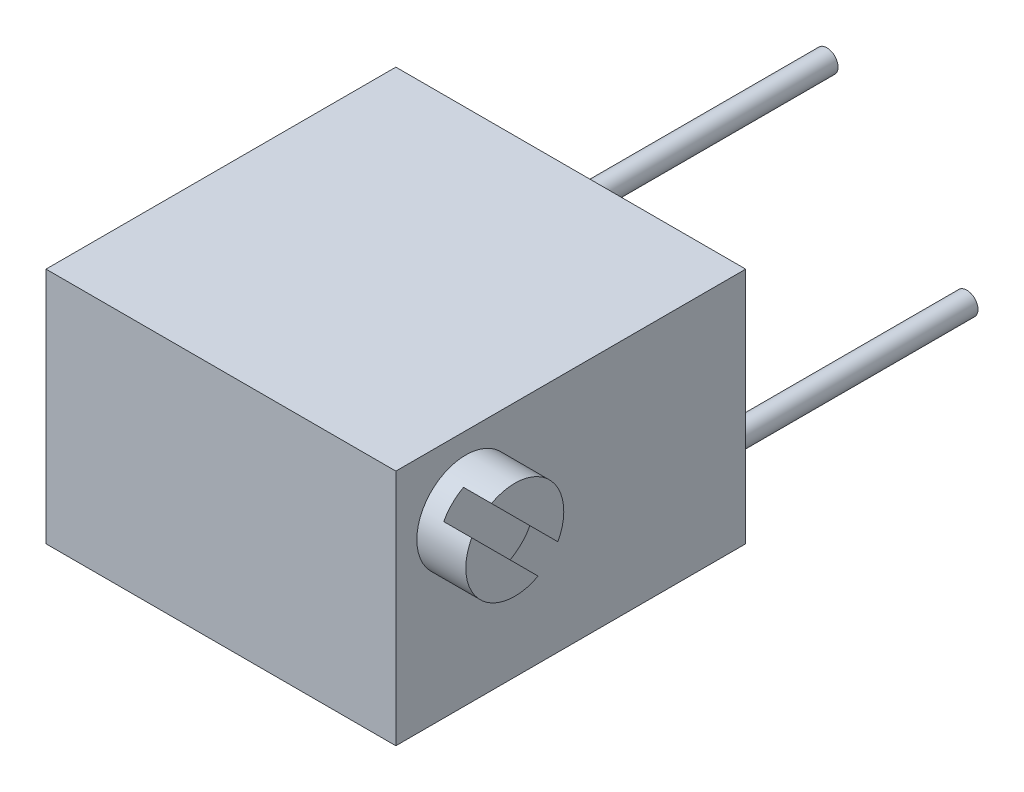
ISO-10303-21;
HEADER;
FILE_DESCRIPTION(('STEP AP214'),'2;1');
FILE_NAME('part.step','',(''),(''),'','','');
FILE_SCHEMA(('AUTOMOTIVE_DESIGN { 1 0 10303 214 1 1 1 1 }'));
ENDSEC;
DATA;
#1=APPLICATION_CONTEXT('core data for automotive mechanical design processes');
#2=APPLICATION_PROTOCOL_DEFINITION('international standard','automotive_design',2000,#1);
#3=PRODUCT_CONTEXT('',#1,'mechanical');
#4=PRODUCT('Part','Part','',(#3));
#5=PRODUCT_RELATED_PRODUCT_CATEGORY('part','',(#4));
#6=PRODUCT_DEFINITION_FORMATION('','',#4);
#7=PRODUCT_DEFINITION_CONTEXT('part definition',#1,'design');
#8=PRODUCT_DEFINITION('design','',#6,#7);
#9=PRODUCT_DEFINITION_SHAPE('','',#8);
#10=(LENGTH_UNIT() NAMED_UNIT(*) SI_UNIT(.MILLI.,.METRE.));
#11=(NAMED_UNIT(*) PLANE_ANGLE_UNIT() SI_UNIT($,.RADIAN.));
#12=(NAMED_UNIT(*) SI_UNIT($,.STERADIAN.) SOLID_ANGLE_UNIT());
#13=UNCERTAINTY_MEASURE_WITH_UNIT(LENGTH_MEASURE(1.E-05),#10,'distance_accuracy_value','');
#14=(GEOMETRIC_REPRESENTATION_CONTEXT(3) GLOBAL_UNCERTAINTY_ASSIGNED_CONTEXT((#13)) GLOBAL_UNIT_ASSIGNED_CONTEXT((#10,
#11,#12)) REPRESENTATION_CONTEXT('',''));
#15=CARTESIAN_POINT('',(0.,0.,0.));
#16=DIRECTION('',(0.,0.,1.));
#17=DIRECTION('',(1.,0.,0.));
#18=AXIS2_PLACEMENT_3D('',#15,#16,#17);
#19=CARTESIAN_POINT('',(-0.507999999999999,-3.302,0.));
#20=DIRECTION('',(0.,0.,1.));
#21=DIRECTION('',(1.,0.,0.));
#22=AXIS2_PLACEMENT_3D('',#19,#20,#21);
#23=PLANE('',#22);
#24=CARTESIAN_POINT('',(5.08,-2.286,0.));
#25=DIRECTION('',(0.,0.,1.));
#26=DIRECTION('',(1.,0.,0.));
#27=AXIS2_PLACEMENT_3D('',#24,#25,#26);
#28=CIRCLE('',#27,0.203199999999999);
#29=CARTESIAN_POINT('',(5.2832,-2.286,0.));
#30=VERTEX_POINT('',#29);
#31=EDGE_CURVE('E42',#30,#30,#28,.F.);
#32=ORIENTED_EDGE('',*,*,#31,.F.);
#33=EDGE_LOOP('',(#32));
#34=FACE_BOUND('',#33,.T.);
#35=DIRECTION('',(0.,-1.,0.));
#36=VECTOR('',#35,1.);
#37=CARTESIAN_POINT('',(-0.508,1.016,0.));
#38=LINE('',#37,#36);
#39=CARTESIAN_POINT('',(-0.508,1.016,0.));
#40=VERTEX_POINT('',#39);
#41=CARTESIAN_POINT('',(-0.507999999999999,-3.302,0.));
#42=VERTEX_POINT('',#41);
#43=EDGE_CURVE('E148',#40,#42,#38,.T.);
#44=ORIENTED_EDGE('',*,*,#43,.F.);
#45=DIRECTION('',(-1.,0.,0.));
#46=VECTOR('',#45,1.);
#47=CARTESIAN_POINT('',(5.842,1.016,0.));
#48=LINE('',#47,#46);
#49=CARTESIAN_POINT('',(5.842,1.016,0.));
#50=VERTEX_POINT('',#49);
#51=EDGE_CURVE('E79',#50,#40,#48,.T.);
#52=ORIENTED_EDGE('',*,*,#51,.F.);
#53=DIRECTION('',(0.,1.,0.));
#54=VECTOR('',#53,1.);
#55=CARTESIAN_POINT('',(5.842,-3.302,0.));
#56=LINE('',#55,#54);
#57=CARTESIAN_POINT('',(5.842,-3.302,0.));
#58=VERTEX_POINT('',#57);
#59=EDGE_CURVE('E153',#58,#50,#56,.T.);
#60=ORIENTED_EDGE('',*,*,#59,.F.);
#61=DIRECTION('',(1.,0.,0.));
#62=VECTOR('',#61,1.);
#63=CARTESIAN_POINT('',(-0.507999999999999,-3.302,0.));
#64=LINE('',#63,#62);
#65=EDGE_CURVE('E151',#42,#58,#64,.T.);
#66=ORIENTED_EDGE('',*,*,#65,.F.);
#67=EDGE_LOOP('',(#44,#52,#60,#66));
#68=FACE_BOUND('',#67,.T.);
#69=CARTESIAN_POINT('',(0.,-2.286,0.));
#70=DIRECTION('',(0.,0.,1.));
#71=DIRECTION('',(1.,0.,0.));
#72=AXIS2_PLACEMENT_3D('',#69,#70,#71);
#73=CIRCLE('',#72,0.2032);
#74=CARTESIAN_POINT('',(0.2032,-2.286,0.));
#75=VERTEX_POINT('',#74);
#76=EDGE_CURVE('E167',#75,#75,#73,.F.);
#77=ORIENTED_EDGE('',*,*,#76,.F.);
#78=EDGE_LOOP('',(#77));
#79=FACE_BOUND('',#78,.T.);
#80=CARTESIAN_POINT('',(2.54,0.254000000000001,0.));
#81=DIRECTION('',(0.,0.,1.));
#82=DIRECTION('',(1.,0.,0.));
#83=AXIS2_PLACEMENT_3D('',#80,#81,#82);
#84=CIRCLE('',#83,0.2032);
#85=CARTESIAN_POINT('',(2.7432,0.254000000000001,0.));
#86=VERTEX_POINT('',#85);
#87=EDGE_CURVE('E11',#86,#86,#84,.F.);
#88=ORIENTED_EDGE('',*,*,#87,.F.);
#89=EDGE_LOOP('',(#88));
#90=FACE_BOUND('',#89,.T.);
#91=ADVANCED_FACE('F34',(#34,#68,#79,#90),#23,.F.);
#92=CARTESIAN_POINT('',(6.731,-0.253999999999999,5.08));
#93=DIRECTION('',(1.,0.,0.));
#94=DIRECTION('',(0.,0.,-1.));
#95=AXIS2_PLACEMENT_3D('',#92,#93,#94);
#96=PLANE('',#95);
#97=DIRECTION('',(0.,-0.707106781186548,-0.707106781186548));
#98=VECTOR('',#97,1.);
#99=CARTESIAN_POINT('',(6.731,-1.03601901668346,4.65719122815931));
#100=LINE('',#99,#98);
#101=CARTESIAN_POINT('',(6.731,0.168808771840694,5.86201901668346));
#102=VERTEX_POINT('',#101);
#103=CARTESIAN_POINT('',(6.731,-1.03601901668346,4.65719122815931));
#104=VERTEX_POINT('',#103);
#105=EDGE_CURVE('E124',#102,#104,#100,.T.);
#106=ORIENTED_EDGE('',*,*,#105,.F.);
#107=CARTESIAN_POINT('',(6.731,-0.253999999999999,5.08));
#108=DIRECTION('',(1.,0.,0.));
#109=DIRECTION('',(0.,0.,-1.));
#110=AXIS2_PLACEMENT_3D('',#107,#108,#109);
#111=CIRCLE('',#110,0.889);
#112=EDGE_CURVE('E139',#102,#104,#111,.T.);
#113=ORIENTED_EDGE('',*,*,#112,.T.);
#114=EDGE_LOOP('',(#106,#113));
#115=FACE_BOUND('',#114,.T.);
#116=ADVANCED_FACE('F176',(#115),#96,.T.);
#117=CARTESIAN_POINT('',(5.842,-3.302,6.35));
#118=DIRECTION('',(-1.,0.,0.));
#119=DIRECTION('',(0.,0.,1.));
#120=AXIS2_PLACEMENT_3D('',#117,#118,#119);
#121=PLANE('',#120);
#122=ORIENTED_EDGE('',*,*,#59,.T.);
#123=DIRECTION('',(0.,0.,-1.));
#124=VECTOR('',#123,1.);
#125=CARTESIAN_POINT('',(5.842,1.016,6.35));
#126=LINE('',#125,#124);
#127=CARTESIAN_POINT('',(5.842,1.016,6.35));
#128=VERTEX_POINT('',#127);
#129=EDGE_CURVE('E157',#128,#50,#126,.T.);
#130=ORIENTED_EDGE('',*,*,#129,.F.);
#131=DIRECTION('',(0.,1.,0.));
#132=VECTOR('',#131,1.);
#133=CARTESIAN_POINT('',(5.842,-3.302,6.35));
#134=LINE('',#133,#132);
#135=CARTESIAN_POINT('',(5.842,-3.302,6.35));
#136=VERTEX_POINT('',#135);
#137=EDGE_CURVE('E144',#136,#128,#134,.T.);
#138=ORIENTED_EDGE('',*,*,#137,.F.);
#139=DIRECTION('',(0.,0.,-1.));
#140=VECTOR('',#139,1.);
#141=CARTESIAN_POINT('',(5.842,-3.302,6.35));
#142=LINE('',#141,#140);
#143=EDGE_CURVE('E159',#136,#58,#142,.T.);
#144=ORIENTED_EDGE('',*,*,#143,.T.);
#145=EDGE_LOOP('',(#122,#130,#138,#144));
#146=FACE_BOUND('',#145,.T.);
#147=CARTESIAN_POINT('',(5.842,-0.253999999999999,5.08));
#148=DIRECTION('',(-1.,0.,0.));
#149=DIRECTION('',(0.,0.,1.));
#150=AXIS2_PLACEMENT_3D('',#147,#148,#149);
#151=CIRCLE('',#150,0.889);
#152=CARTESIAN_POINT('',(5.842,-0.253999999999999,5.969));
#153=VERTEX_POINT('',#152);
#154=EDGE_CURVE('E164',#153,#153,#151,.F.);
#155=ORIENTED_EDGE('',*,*,#154,.F.);
#156=EDGE_LOOP('',(#155));
#157=FACE_BOUND('',#156,.T.);
#158=ADVANCED_FACE('F232',(#146,#157),#121,.F.);
#159=CARTESIAN_POINT('',(-0.508,1.016,6.35));
#160=DIRECTION('',(1.,0.,0.));
#161=DIRECTION('',(0.,1.,0.));
#162=AXIS2_PLACEMENT_3D('',#159,#160,#161);
#163=PLANE('',#162);
#164=ORIENTED_EDGE('',*,*,#43,.T.);
#165=DIRECTION('',(0.,0.,-1.));
#166=VECTOR('',#165,1.);
#167=CARTESIAN_POINT('',(-0.507999999999999,-3.302,6.35));
#168=LINE('',#167,#166);
#169=CARTESIAN_POINT('',(-0.507999999999999,-3.302,6.35));
#170=VERTEX_POINT('',#169);
#171=EDGE_CURVE('E162',#170,#42,#168,.T.);
#172=ORIENTED_EDGE('',*,*,#171,.F.);
#173=DIRECTION('',(0.,-1.,0.));
#174=VECTOR('',#173,1.);
#175=CARTESIAN_POINT('',(-0.508,1.016,6.35));
#176=LINE('',#175,#174);
#177=CARTESIAN_POINT('',(-0.508,1.016,6.35));
#178=VERTEX_POINT('',#177);
#179=EDGE_CURVE('E141',#178,#170,#176,.T.);
#180=ORIENTED_EDGE('',*,*,#179,.F.);
#181=DIRECTION('',(0.,0.,-1.));
#182=VECTOR('',#181,1.);
#183=CARTESIAN_POINT('',(-0.508,1.016,6.35));
#184=LINE('',#183,#182);
#185=EDGE_CURVE('E147',#178,#40,#184,.T.);
#186=ORIENTED_EDGE('',*,*,#185,.T.);
#187=EDGE_LOOP('',(#164,#172,#180,#186));
#188=FACE_BOUND('',#187,.T.);
#189=ADVANCED_FACE('F36',(#188),#163,.F.);
#190=CARTESIAN_POINT('',(-0.507999999999999,-3.302,6.35));
#191=DIRECTION('',(0.,1.,0.));
#192=DIRECTION('',(0.,0.,1.));
#193=AXIS2_PLACEMENT_3D('',#190,#191,#192);
#194=PLANE('',#193);
#195=ORIENTED_EDGE('',*,*,#65,.T.);
#196=ORIENTED_EDGE('',*,*,#143,.F.);
#197=DIRECTION('',(1.,0.,0.));
#198=VECTOR('',#197,1.);
#199=CARTESIAN_POINT('',(-0.507999999999999,-3.302,6.35));
#200=LINE('',#199,#198);
#201=EDGE_CURVE('E87',#170,#136,#200,.T.);
#202=ORIENTED_EDGE('',*,*,#201,.F.);
#203=ORIENTED_EDGE('',*,*,#171,.T.);
#204=EDGE_LOOP('',(#195,#196,#202,#203));
#205=FACE_BOUND('',#204,.T.);
#206=ADVANCED_FACE('F231',(#205),#194,.F.);
#207=CARTESIAN_POINT('',(5.842,1.016,6.35));
#208=DIRECTION('',(0.,-1.,0.));
#209=DIRECTION('',(1.,0.,0.));
#210=AXIS2_PLACEMENT_3D('',#207,#208,#209);
#211=PLANE('',#210);
#212=ORIENTED_EDGE('',*,*,#51,.T.);
#213=ORIENTED_EDGE('',*,*,#185,.F.);
#214=DIRECTION('',(-1.,0.,0.));
#215=VECTOR('',#214,1.);
#216=CARTESIAN_POINT('',(5.842,1.016,6.35));
#217=LINE('',#216,#215);
#218=EDGE_CURVE('E58',#128,#178,#217,.T.);
#219=ORIENTED_EDGE('',*,*,#218,.F.);
#220=ORIENTED_EDGE('',*,*,#129,.T.);
#221=EDGE_LOOP('',(#212,#213,#219,#220));
#222=FACE_BOUND('',#221,.T.);
#223=ADVANCED_FACE('F227',(#222),#211,.F.);
#224=CARTESIAN_POINT('',(-0.507999999999999,-3.302,6.35));
#225=DIRECTION('',(0.,0.,1.));
#226=DIRECTION('',(1.,0.,0.));
#227=AXIS2_PLACEMENT_3D('',#224,#225,#226);
#228=PLANE('',#227);
#229=ORIENTED_EDGE('',*,*,#179,.T.);
#230=ORIENTED_EDGE('',*,*,#201,.T.);
#231=ORIENTED_EDGE('',*,*,#137,.T.);
#232=ORIENTED_EDGE('',*,*,#218,.T.);
#233=EDGE_LOOP('',(#229,#230,#231,#232));
#234=FACE_BOUND('',#233,.T.);
#235=ADVANCED_FACE('F225',(#234),#228,.T.);
#236=CARTESIAN_POINT('',(6.731,-0.253999999999999,5.08));
#237=DIRECTION('',(-1.,0.,0.));
#238=DIRECTION('',(0.,0.,1.));
#239=AXIS2_PLACEMENT_3D('',#236,#237,#238);
#240=CYLINDRICAL_SURFACE('',#239,0.889);
#241=ORIENTED_EDGE('',*,*,#112,.F.);
#242=DIRECTION('',(1.,0.,0.));
#243=VECTOR('',#242,1.);
#244=CARTESIAN_POINT('',(6.223,0.168808771840694,5.86201901668346));
#245=LINE('',#244,#243);
#246=CARTESIAN_POINT('',(6.223,0.168808771840694,5.86201901668346));
#247=VERTEX_POINT('',#246);
#248=EDGE_CURVE('E133',#247,#102,#245,.T.);
#249=ORIENTED_EDGE('',*,*,#248,.F.);
#250=CARTESIAN_POINT('',(6.223,-0.253999999999999,5.08));
#251=DIRECTION('',(1.,0.,0.));
#252=DIRECTION('',(0.,0.,-1.));
#253=AXIS2_PLACEMENT_3D('',#250,#251,#252);
#254=CIRCLE('',#253,0.889);
#255=CARTESIAN_POINT('',(6.223,0.52801901668346,5.50280877184069));
#256=VERTEX_POINT('',#255);
#257=EDGE_CURVE('E114',#256,#247,#254,.T.);
#258=ORIENTED_EDGE('',*,*,#257,.F.);
#259=DIRECTION('',(1.,0.,0.));
#260=VECTOR('',#259,1.);
#261=CARTESIAN_POINT('',(6.223,0.52801901668346,5.50280877184069));
#262=LINE('',#261,#260);
#263=CARTESIAN_POINT('',(6.731,0.52801901668346,5.50280877184069));
#264=VERTEX_POINT('',#263);
#265=EDGE_CURVE('E111',#256,#264,#262,.T.);
#266=ORIENTED_EDGE('',*,*,#265,.T.);
#267=CARTESIAN_POINT('',(6.731,-0.676808771840692,4.29798098331654));
#268=VERTEX_POINT('',#267);
#269=EDGE_CURVE('E131',#268,#264,#111,.T.);
#270=ORIENTED_EDGE('',*,*,#269,.F.);
#271=DIRECTION('',(1.,0.,0.));
#272=VECTOR('',#271,1.);
#273=CARTESIAN_POINT('',(6.223,-0.676808771840693,4.29798098331654));
#274=LINE('',#273,#272);
#275=CARTESIAN_POINT('',(6.223,-0.676808771840693,4.29798098331654));
#276=VERTEX_POINT('',#275);
#277=EDGE_CURVE('E49',#276,#268,#274,.T.);
#278=ORIENTED_EDGE('',*,*,#277,.F.);
#279=CARTESIAN_POINT('',(6.223,-0.253999999999999,5.08));
#280=DIRECTION('',(1.,0.,0.));
#281=DIRECTION('',(0.,0.,-1.));
#282=AXIS2_PLACEMENT_3D('',#279,#280,#281);
#283=CIRCLE('',#282,0.889);
#284=CARTESIAN_POINT('',(6.223,-1.03601901668346,4.65719122815931));
#285=VERTEX_POINT('',#284);
#286=EDGE_CURVE('E115',#285,#276,#283,.T.);
#287=ORIENTED_EDGE('',*,*,#286,.F.);
#288=DIRECTION('',(1.,0.,0.));
#289=VECTOR('',#288,1.);
#290=CARTESIAN_POINT('',(6.223,-1.03601901668346,4.65719122815931));
#291=LINE('',#290,#289);
#292=EDGE_CURVE('E140',#285,#104,#291,.T.);
#293=ORIENTED_EDGE('',*,*,#292,.T.);
#294=EDGE_LOOP('',(#241,#249,#258,#266,#270,#278,#287,#293));
#295=FACE_BOUND('',#294,.T.);
#296=ORIENTED_EDGE('',*,*,#154,.T.);
#297=EDGE_LOOP('',(#296));
#298=FACE_BOUND('',#297,.T.);
#299=ADVANCED_FACE('F128',(#295,#298),#240,.T.);
#300=DIRECTION('',(0.,0.707106781186548,0.707106781186548));
#301=VECTOR('',#300,1.);
#302=CARTESIAN_POINT('',(6.731,-0.676808771840693,4.29798098331654));
#303=LINE('',#302,#301);
#304=EDGE_CURVE('E355',#268,#264,#303,.T.);
#305=ORIENTED_EDGE('',*,*,#304,.F.);
#306=ORIENTED_EDGE('',*,*,#269,.T.);
#307=EDGE_LOOP('',(#305,#306));
#308=FACE_BOUND('',#307,.T.);
#309=ADVANCED_FACE('F216',(#308),#96,.T.);
#310=CARTESIAN_POINT('',(6.223,-1.03601901668346,4.65719122815931));
#311=DIRECTION('',(0.,-0.707106781186548,0.707106781186548));
#312=DIRECTION('',(0.,-0.707106781186548,-0.707106781186548));
#313=AXIS2_PLACEMENT_3D('',#310,#311,#312);
#314=PLANE('',#313);
#315=ORIENTED_EDGE('',*,*,#105,.T.);
#316=ORIENTED_EDGE('',*,*,#292,.F.);
#317=DIRECTION('',(0.,-0.707106781186548,-0.707106781186548));
#318=VECTOR('',#317,1.);
#319=CARTESIAN_POINT('',(6.223,-1.03601901668346,4.65719122815931));
#320=LINE('',#319,#318);
#321=EDGE_CURVE('E121',#247,#285,#320,.T.);
#322=ORIENTED_EDGE('',*,*,#321,.F.);
#323=ORIENTED_EDGE('',*,*,#248,.T.);
#324=EDGE_LOOP('',(#315,#316,#322,#323));
#325=FACE_BOUND('',#324,.T.);
#326=ADVANCED_FACE('F213',(#325),#314,.F.);
#327=CARTESIAN_POINT('',(6.223,-0.676808771840693,4.29798098331654));
#328=DIRECTION('',(0.,0.707106781186548,-0.707106781186548));
#329=DIRECTION('',(0.,0.707106781186548,0.707106781186548));
#330=AXIS2_PLACEMENT_3D('',#327,#328,#329);
#331=PLANE('',#330);
#332=ORIENTED_EDGE('',*,*,#304,.T.);
#333=ORIENTED_EDGE('',*,*,#265,.F.);
#334=DIRECTION('',(0.,0.707106781186548,0.707106781186548));
#335=VECTOR('',#334,1.);
#336=CARTESIAN_POINT('',(6.223,-0.676808771840693,4.29798098331654));
#337=LINE('',#336,#335);
#338=EDGE_CURVE('E107',#276,#256,#337,.T.);
#339=ORIENTED_EDGE('',*,*,#338,.F.);
#340=ORIENTED_EDGE('',*,*,#277,.T.);
#341=EDGE_LOOP('',(#332,#333,#339,#340));
#342=FACE_BOUND('',#341,.T.);
#343=ADVANCED_FACE('F109',(#342),#331,.F.);
#344=CARTESIAN_POINT('',(6.223,-0.253999999999999,5.08));
#345=DIRECTION('',(1.,0.,0.));
#346=DIRECTION('',(0.,0.,-1.));
#347=AXIS2_PLACEMENT_3D('',#344,#345,#346);
#348=PLANE('',#347);
#349=ORIENTED_EDGE('',*,*,#286,.T.);
#350=ORIENTED_EDGE('',*,*,#338,.T.);
#351=ORIENTED_EDGE('',*,*,#257,.T.);
#352=ORIENTED_EDGE('',*,*,#321,.T.);
#353=EDGE_LOOP('',(#349,#350,#351,#352));
#354=FACE_BOUND('',#353,.T.);
#355=ADVANCED_FACE('F119',(#354),#348,.T.);
#356=CARTESIAN_POINT('',(0.,-2.286,-4.7752));
#357=DIRECTION('',(0.,0.,1.));
#358=DIRECTION('',(1.,0.,0.));
#359=AXIS2_PLACEMENT_3D('',#356,#357,#358);
#360=CYLINDRICAL_SURFACE('',#359,0.2032);
#361=CARTESIAN_POINT('',(0.,-2.286,-4.7752));
#362=DIRECTION('',(0.,0.,-1.));
#363=DIRECTION('',(-1.,0.,0.));
#364=AXIS2_PLACEMENT_3D('',#361,#362,#363);
#365=CIRCLE('',#364,0.2032);
#366=CARTESIAN_POINT('',(-0.2032,-2.286,-4.7752));
#367=VERTEX_POINT('',#366);
#368=EDGE_CURVE('E360',#367,#367,#365,.T.);
#369=ORIENTED_EDGE('',*,*,#368,.F.);
#370=EDGE_LOOP('',(#369));
#371=FACE_BOUND('',#370,.T.);
#372=ORIENTED_EDGE('',*,*,#76,.T.);
#373=EDGE_LOOP('',(#372));
#374=FACE_BOUND('',#373,.T.);
#375=ADVANCED_FACE('F206',(#371,#374),#360,.T.);
#376=CARTESIAN_POINT('',(0.,-2.286,-4.7752));
#377=DIRECTION('',(0.,0.,-1.));
#378=DIRECTION('',(-1.,0.,0.));
#379=AXIS2_PLACEMENT_3D('',#376,#377,#378);
#380=PLANE('',#379);
#381=ORIENTED_EDGE('',*,*,#368,.T.);
#382=EDGE_LOOP('',(#381));
#383=FACE_BOUND('',#382,.T.);
#384=ADVANCED_FACE('F202',(#383),#380,.T.);
#385=CARTESIAN_POINT('',(5.08,-2.286,-4.7752));
#386=DIRECTION('',(0.,0.,1.));
#387=DIRECTION('',(1.,0.,0.));
#388=AXIS2_PLACEMENT_3D('',#385,#386,#387);
#389=CYLINDRICAL_SURFACE('',#388,0.203199999999999);
#390=CARTESIAN_POINT('',(5.08,-2.286,-4.7752));
#391=DIRECTION('',(0.,0.,-1.));
#392=DIRECTION('',(-1.,0.,0.));
#393=AXIS2_PLACEMENT_3D('',#390,#391,#392);
#394=CIRCLE('',#393,0.203199999999999);
#395=CARTESIAN_POINT('',(4.8768,-2.286,-4.7752));
#396=VERTEX_POINT('',#395);
#397=EDGE_CURVE('E365',#396,#396,#394,.T.);
#398=ORIENTED_EDGE('',*,*,#397,.F.);
#399=EDGE_LOOP('',(#398));
#400=FACE_BOUND('',#399,.T.);
#401=ORIENTED_EDGE('',*,*,#31,.T.);
#402=EDGE_LOOP('',(#401));
#403=FACE_BOUND('',#402,.T.);
#404=ADVANCED_FACE('F172',(#400,#403),#389,.T.);
#405=CARTESIAN_POINT('',(5.08,-2.286,-4.7752));
#406=DIRECTION('',(0.,0.,-1.));
#407=DIRECTION('',(-1.,0.,0.));
#408=AXIS2_PLACEMENT_3D('',#405,#406,#407);
#409=PLANE('',#408);
#410=ORIENTED_EDGE('',*,*,#397,.T.);
#411=EDGE_LOOP('',(#410));
#412=FACE_BOUND('',#411,.T.);
#413=ADVANCED_FACE('F187',(#412),#409,.T.);
#414=CARTESIAN_POINT('',(2.54,0.254000000000001,-4.7752));
#415=DIRECTION('',(0.,0.,1.));
#416=DIRECTION('',(1.,0.,0.));
#417=AXIS2_PLACEMENT_3D('',#414,#415,#416);
#418=CYLINDRICAL_SURFACE('',#417,0.2032);
#419=CARTESIAN_POINT('',(2.54,0.254000000000001,-4.7752));
#420=DIRECTION('',(0.,0.,-1.));
#421=DIRECTION('',(-1.,0.,0.));
#422=AXIS2_PLACEMENT_3D('',#419,#420,#421);
#423=CIRCLE('',#422,0.2032);
#424=CARTESIAN_POINT('',(2.3368,0.254000000000001,-4.7752));
#425=VERTEX_POINT('',#424);
#426=EDGE_CURVE('E368',#425,#425,#423,.T.);
#427=ORIENTED_EDGE('',*,*,#426,.F.);
#428=EDGE_LOOP('',(#427));
#429=FACE_BOUND('',#428,.T.);
#430=ORIENTED_EDGE('',*,*,#87,.T.);
#431=EDGE_LOOP('',(#430));
#432=FACE_BOUND('',#431,.T.);
#433=ADVANCED_FACE('F184',(#429,#432),#418,.T.);
#434=CARTESIAN_POINT('',(2.54,0.254000000000001,-4.7752));
#435=DIRECTION('',(0.,0.,-1.));
#436=DIRECTION('',(-1.,0.,0.));
#437=AXIS2_PLACEMENT_3D('',#434,#435,#436);
#438=PLANE('',#437);
#439=ORIENTED_EDGE('',*,*,#426,.T.);
#440=EDGE_LOOP('',(#439));
#441=FACE_BOUND('',#440,.T.);
#442=ADVANCED_FACE('F186',(#441),#438,.T.);
#443=CLOSED_SHELL('',(#91,#116,#158,#189,#206,#223,#235,#299,#309,#326,#343,#355,#375,#384,#404,
#413,#433,#442));
#444=MANIFOLD_SOLID_BREP('B2',#443);
#445=ADVANCED_BREP_SHAPE_REPRESENTATION('',(#18,#444),#14);
#446=SHAPE_DEFINITION_REPRESENTATION(#9,#445);
ENDSEC;
END-ISO-10303-21;
